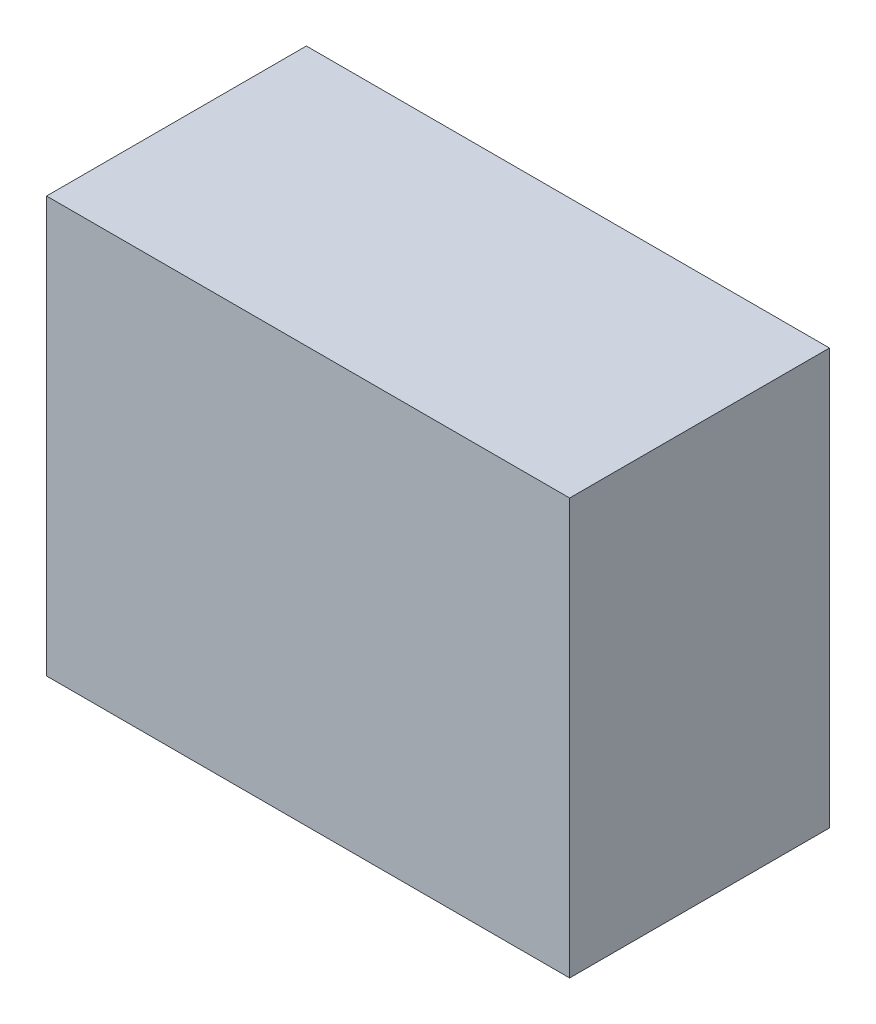
ISO-10303-21;
HEADER;
FILE_DESCRIPTION(('STEP AP214'),'2;1');
FILE_NAME('part.step','',(''),(''),'','','');
FILE_SCHEMA(('AUTOMOTIVE_DESIGN { 1 0 10303 214 1 1 1 1 }'));
ENDSEC;
DATA;
#1=APPLICATION_CONTEXT('core data for automotive mechanical design processes');
#2=APPLICATION_PROTOCOL_DEFINITION('international standard','automotive_design',2000,#1);
#3=PRODUCT_CONTEXT('',#1,'mechanical');
#4=PRODUCT('Part','Part','',(#3));
#5=PRODUCT_RELATED_PRODUCT_CATEGORY('part','',(#4));
#6=PRODUCT_DEFINITION_FORMATION('','',#4);
#7=PRODUCT_DEFINITION_CONTEXT('part definition',#1,'design');
#8=PRODUCT_DEFINITION('design','',#6,#7);
#9=PRODUCT_DEFINITION_SHAPE('','',#8);
#10=(LENGTH_UNIT() NAMED_UNIT(*) SI_UNIT(.MILLI.,.METRE.));
#11=(NAMED_UNIT(*) PLANE_ANGLE_UNIT() SI_UNIT($,.RADIAN.));
#12=(NAMED_UNIT(*) SI_UNIT($,.STERADIAN.) SOLID_ANGLE_UNIT());
#13=UNCERTAINTY_MEASURE_WITH_UNIT(LENGTH_MEASURE(1.E-05),#10,'distance_accuracy_value','');
#14=(GEOMETRIC_REPRESENTATION_CONTEXT(3) GLOBAL_UNCERTAINTY_ASSIGNED_CONTEXT((#13)) GLOBAL_UNIT_ASSIGNED_CONTEXT((#10,
#11,#12)) REPRESENTATION_CONTEXT('',''));
#15=CARTESIAN_POINT('',(0.,0.,0.));
#16=DIRECTION('',(0.,0.,1.));
#17=DIRECTION('',(1.,0.,0.));
#18=AXIS2_PLACEMENT_3D('',#15,#16,#17);
#19=CARTESIAN_POINT('',(-75.5,-60.,75.));
#20=DIRECTION('',(-1.,0.,0.));
#21=DIRECTION('',(0.,0.,1.));
#22=AXIS2_PLACEMENT_3D('',#19,#20,#21);
#23=PLANE('',#22);
#24=DIRECTION('',(0.,1.,0.));
#25=VECTOR('',#24,1.);
#26=CARTESIAN_POINT('',(-75.5,-60.,0.));
#27=LINE('',#26,#25);
#28=CARTESIAN_POINT('',(-75.5,-60.,0.));
#29=VERTEX_POINT('',#28);
#30=CARTESIAN_POINT('',(-75.5,60.,0.));
#31=VERTEX_POINT('',#30);
#32=EDGE_CURVE('E101',#29,#31,#27,.T.);
#33=ORIENTED_EDGE('',*,*,#32,.F.);
#34=DIRECTION('',(0.,0.,-1.));
#35=VECTOR('',#34,1.);
#36=CARTESIAN_POINT('',(-75.5,-60.,75.));
#37=LINE('',#36,#35);
#38=CARTESIAN_POINT('',(-75.5,-60.,75.));
#39=VERTEX_POINT('',#38);
#40=EDGE_CURVE('E11',#39,#29,#37,.T.);
#41=ORIENTED_EDGE('',*,*,#40,.F.);
#42=DIRECTION('',(0.,1.,0.));
#43=VECTOR('',#42,1.);
#44=CARTESIAN_POINT('',(-75.5,-60.,75.));
#45=LINE('',#44,#43);
#46=CARTESIAN_POINT('',(-75.5,60.,75.));
#47=VERTEX_POINT('',#46);
#48=EDGE_CURVE('E95',#39,#47,#45,.T.);
#49=ORIENTED_EDGE('',*,*,#48,.T.);
#50=DIRECTION('',(0.,0.,-1.));
#51=VECTOR('',#50,1.);
#52=CARTESIAN_POINT('',(-75.5,60.,75.));
#53=LINE('',#52,#51);
#54=EDGE_CURVE('E40',#47,#31,#53,.T.);
#55=ORIENTED_EDGE('',*,*,#54,.T.);
#56=EDGE_LOOP('',(#33,#41,#49,#55));
#57=FACE_BOUND('',#56,.T.);
#58=ADVANCED_FACE('F37',(#57),#23,.T.);
#59=CARTESIAN_POINT('',(75.5,-60.,75.));
#60=DIRECTION('',(0.,-1.,0.));
#61=DIRECTION('',(0.,0.,-1.));
#62=AXIS2_PLACEMENT_3D('',#59,#60,#61);
#63=PLANE('',#62);
#64=DIRECTION('',(-1.,0.,0.));
#65=VECTOR('',#64,1.);
#66=CARTESIAN_POINT('',(75.5,-60.,0.));
#67=LINE('',#66,#65);
#68=CARTESIAN_POINT('',(75.5,-60.,0.));
#69=VERTEX_POINT('',#68);
#70=EDGE_CURVE('E97',#69,#29,#67,.T.);
#71=ORIENTED_EDGE('',*,*,#70,.F.);
#72=DIRECTION('',(0.,0.,-1.));
#73=VECTOR('',#72,1.);
#74=CARTESIAN_POINT('',(75.5,-60.,75.));
#75=LINE('',#74,#73);
#76=CARTESIAN_POINT('',(75.5,-60.,75.));
#77=VERTEX_POINT('',#76);
#78=EDGE_CURVE('E46',#77,#69,#75,.T.);
#79=ORIENTED_EDGE('',*,*,#78,.F.);
#80=DIRECTION('',(-1.,0.,0.));
#81=VECTOR('',#80,1.);
#82=CARTESIAN_POINT('',(75.5,-60.,75.));
#83=LINE('',#82,#81);
#84=EDGE_CURVE('E92',#77,#39,#83,.T.);
#85=ORIENTED_EDGE('',*,*,#84,.T.);
#86=ORIENTED_EDGE('',*,*,#40,.T.);
#87=EDGE_LOOP('',(#71,#79,#85,#86));
#88=FACE_BOUND('',#87,.T.);
#89=ADVANCED_FACE('F111',(#88),#63,.T.);
#90=CARTESIAN_POINT('',(75.5,60.,75.));
#91=DIRECTION('',(1.,0.,0.));
#92=DIRECTION('',(0.,0.,-1.));
#93=AXIS2_PLACEMENT_3D('',#90,#91,#92);
#94=PLANE('',#93);
#95=DIRECTION('',(0.,-1.,0.));
#96=VECTOR('',#95,1.);
#97=CARTESIAN_POINT('',(75.5,60.,0.));
#98=LINE('',#97,#96);
#99=CARTESIAN_POINT('',(75.5,60.,0.));
#100=VERTEX_POINT('',#99);
#101=EDGE_CURVE('E87',#100,#69,#98,.T.);
#102=ORIENTED_EDGE('',*,*,#101,.F.);
#103=DIRECTION('',(0.,0.,-1.));
#104=VECTOR('',#103,1.);
#105=CARTESIAN_POINT('',(75.5,60.,75.));
#106=LINE('',#105,#104);
#107=CARTESIAN_POINT('',(75.5,60.,75.));
#108=VERTEX_POINT('',#107);
#109=EDGE_CURVE('E82',#108,#100,#106,.T.);
#110=ORIENTED_EDGE('',*,*,#109,.F.);
#111=DIRECTION('',(0.,-1.,0.));
#112=VECTOR('',#111,1.);
#113=CARTESIAN_POINT('',(75.5,60.,75.));
#114=LINE('',#113,#112);
#115=EDGE_CURVE('E85',#108,#77,#114,.T.);
#116=ORIENTED_EDGE('',*,*,#115,.T.);
#117=ORIENTED_EDGE('',*,*,#78,.T.);
#118=EDGE_LOOP('',(#102,#110,#116,#117));
#119=FACE_BOUND('',#118,.T.);
#120=ADVANCED_FACE('F84',(#119),#94,.T.);
#121=CARTESIAN_POINT('',(-75.5,60.,75.));
#122=DIRECTION('',(0.,1.,0.));
#123=DIRECTION('',(0.,0.,1.));
#124=AXIS2_PLACEMENT_3D('',#121,#122,#123);
#125=PLANE('',#124);
#126=DIRECTION('',(1.,0.,0.));
#127=VECTOR('',#126,1.);
#128=CARTESIAN_POINT('',(-75.5,60.,0.));
#129=LINE('',#128,#127);
#130=EDGE_CURVE('E104',#31,#100,#129,.T.);
#131=ORIENTED_EDGE('',*,*,#130,.F.);
#132=ORIENTED_EDGE('',*,*,#54,.F.);
#133=DIRECTION('',(1.,0.,0.));
#134=VECTOR('',#133,1.);
#135=CARTESIAN_POINT('',(-75.5,60.,75.));
#136=LINE('',#135,#134);
#137=EDGE_CURVE('E91',#47,#108,#136,.T.);
#138=ORIENTED_EDGE('',*,*,#137,.T.);
#139=ORIENTED_EDGE('',*,*,#109,.T.);
#140=EDGE_LOOP('',(#131,#132,#138,#139));
#141=FACE_BOUND('',#140,.T.);
#142=ADVANCED_FACE('F94',(#141),#125,.T.);
#143=CARTESIAN_POINT('',(0.,0.,75.));
#144=DIRECTION('',(0.,0.,-1.));
#145=DIRECTION('',(-1.,0.,0.));
#146=AXIS2_PLACEMENT_3D('',#143,#144,#145);
#147=PLANE('',#146);
#148=ORIENTED_EDGE('',*,*,#48,.F.);
#149=ORIENTED_EDGE('',*,*,#84,.F.);
#150=ORIENTED_EDGE('',*,*,#115,.F.);
#151=ORIENTED_EDGE('',*,*,#137,.F.);
#152=EDGE_LOOP('',(#148,#149,#150,#151));
#153=FACE_BOUND('',#152,.T.);
#154=ADVANCED_FACE('F90',(#153),#147,.F.);
#155=CARTESIAN_POINT('',(0.,0.,0.));
#156=DIRECTION('',(0.,0.,-1.));
#157=DIRECTION('',(-1.,0.,0.));
#158=AXIS2_PLACEMENT_3D('',#155,#156,#157);
#159=PLANE('',#158);
#160=ORIENTED_EDGE('',*,*,#32,.T.);
#161=ORIENTED_EDGE('',*,*,#130,.T.);
#162=ORIENTED_EDGE('',*,*,#101,.T.);
#163=ORIENTED_EDGE('',*,*,#70,.T.);
#164=EDGE_LOOP('',(#160,#161,#162,#163));
#165=FACE_BOUND('',#164,.T.);
#166=ADVANCED_FACE('F110',(#165),#159,.T.);
#167=CLOSED_SHELL('',(#58,#89,#120,#142,#154,#166));
#168=MANIFOLD_SOLID_BREP('B2',#167);
#169=ADVANCED_BREP_SHAPE_REPRESENTATION('',(#18,#168),#14);
#170=SHAPE_DEFINITION_REPRESENTATION(#9,#169);
ENDSEC;
END-ISO-10303-21;
